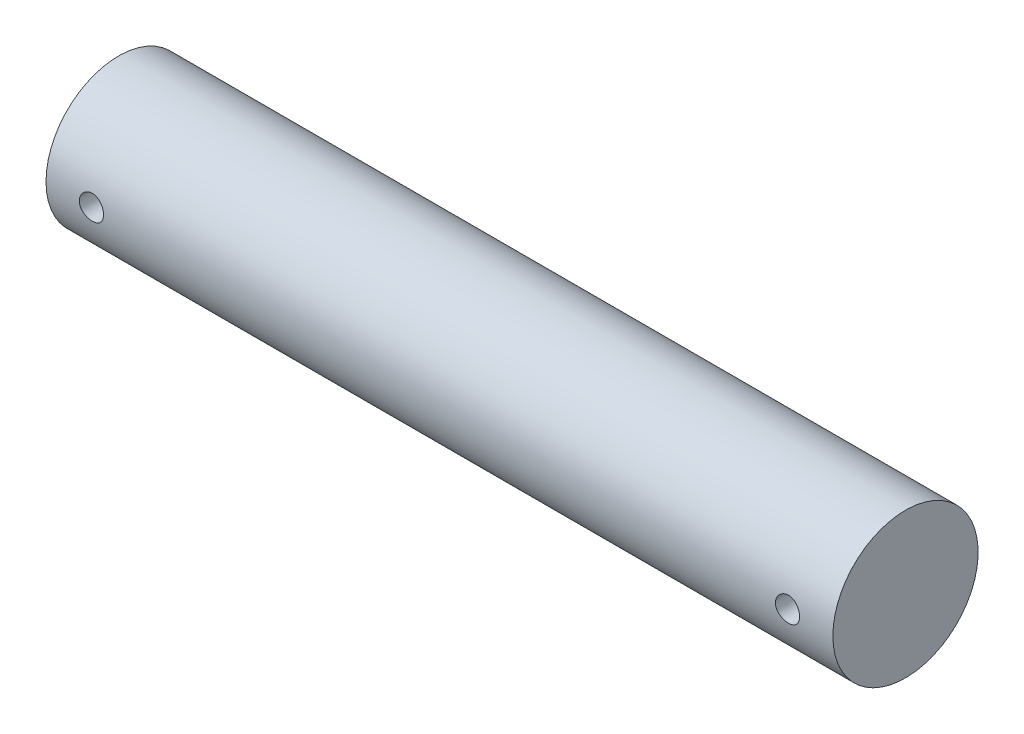
ISO-10303-21;
HEADER;
FILE_DESCRIPTION(('STEP AP214'),'2;1');
FILE_NAME('part.step','',(''),(''),'','','');
FILE_SCHEMA(('AUTOMOTIVE_DESIGN { 1 0 10303 214 1 1 1 1 }'));
ENDSEC;
DATA;
#1=APPLICATION_CONTEXT('core data for automotive mechanical design processes');
#2=APPLICATION_PROTOCOL_DEFINITION('international standard','automotive_design',2000,#1);
#3=PRODUCT_CONTEXT('',#1,'mechanical');
#4=PRODUCT('Part','Part','',(#3));
#5=PRODUCT_RELATED_PRODUCT_CATEGORY('part','',(#4));
#6=PRODUCT_DEFINITION_FORMATION('','',#4);
#7=PRODUCT_DEFINITION_CONTEXT('part definition',#1,'design');
#8=PRODUCT_DEFINITION('design','',#6,#7);
#9=PRODUCT_DEFINITION_SHAPE('','',#8);
#10=(LENGTH_UNIT() NAMED_UNIT(*) SI_UNIT(.MILLI.,.METRE.));
#11=(NAMED_UNIT(*) PLANE_ANGLE_UNIT() SI_UNIT($,.RADIAN.));
#12=(NAMED_UNIT(*) SI_UNIT($,.STERADIAN.) SOLID_ANGLE_UNIT());
#13=UNCERTAINTY_MEASURE_WITH_UNIT(LENGTH_MEASURE(1.E-05),#10,'distance_accuracy_value','');
#14=(GEOMETRIC_REPRESENTATION_CONTEXT(3) GLOBAL_UNCERTAINTY_ASSIGNED_CONTEXT((#13)) GLOBAL_UNIT_ASSIGNED_CONTEXT((#10,
#11,#12)) REPRESENTATION_CONTEXT('',''));
#15=CARTESIAN_POINT('',(0.,0.,0.));
#16=DIRECTION('',(0.,0.,1.));
#17=DIRECTION('',(1.,0.,0.));
#18=AXIS2_PLACEMENT_3D('',#15,#16,#17);
#19=CARTESIAN_POINT('',(0.,0.,0.));
#20=DIRECTION('',(-1.,0.,0.));
#21=DIRECTION('',(0.,0.,1.));
#22=AXIS2_PLACEMENT_3D('',#19,#20,#21);
#23=CYLINDRICAL_SURFACE('',#22,12.);
#24=CARTESIAN_POINT('',(0.,0.,0.));
#25=DIRECTION('',(-1.,0.,0.));
#26=DIRECTION('',(0.,0.,1.));
#27=AXIS2_PLACEMENT_3D('',#24,#25,#26);
#28=CIRCLE('',#27,12.);
#29=CARTESIAN_POINT('',(0.,0.,12.));
#30=VERTEX_POINT('',#29);
#31=EDGE_CURVE('E83',#30,#30,#28,.T.);
#32=ORIENTED_EDGE('',*,*,#31,.F.);
#33=EDGE_LOOP('',(#32));
#34=FACE_BOUND('',#33,.T.);
#35=CARTESIAN_POINT('',(130.,0.,0.));
#36=DIRECTION('',(-1.,0.,0.));
#37=DIRECTION('',(0.,0.,1.));
#38=AXIS2_PLACEMENT_3D('',#35,#36,#37);
#39=CIRCLE('',#38,12.);
#40=CARTESIAN_POINT('',(130.,0.,12.));
#41=VERTEX_POINT('',#40);
#42=EDGE_CURVE('E86',#41,#41,#39,.T.);
#43=ORIENTED_EDGE('',*,*,#42,.T.);
#44=EDGE_LOOP('',(#43));
#45=FACE_BOUND('',#44,.T.);
#46=CARTESIAN_POINT('',(120.5,0.,-12.));
#47=CARTESIAN_POINT('',(120.500004471158,0.11151272396657,-11.9999980893506));
#48=CARTESIAN_POINT('',(120.509357819975,0.223086305471052,-11.9984294233043));
#49=CARTESIAN_POINT('',(120.546508527012,0.443104177338426,-11.9923227595311));
#50=CARTESIAN_POINT('',(120.574322845529,0.551545494367388,-11.9877820313911));
#51=CARTESIAN_POINT('',(120.647532358874,0.762083797770104,-11.9762405458916));
#52=CARTESIAN_POINT('',(120.692913172513,0.864185894745509,-11.9692418012735));
#53=CARTESIAN_POINT('',(120.799929833642,1.05931347358234,-11.9535538166566));
#54=CARTESIAN_POINT('',(120.861563821986,1.15233999190286,-11.9448647700355));
#55=CARTESIAN_POINT('',(120.999964067056,1.32757809143332,-11.9266665396665));
#56=CARTESIAN_POINT('',(121.076855291709,1.40969032282795,-11.9171509745189));
#57=CARTESIAN_POINT('',(121.243318374778,1.55991079892791,-11.8984210150139));
#58=CARTESIAN_POINT('',(121.332891033165,1.62801815951275,-11.8892066397013));
#59=CARTESIAN_POINT('',(121.522856772958,1.74869370048408,-11.8720605260782));
#60=CARTESIAN_POINT('',(121.623313069444,1.80116364228877,-11.8641370327331));
#61=CARTESIAN_POINT('',(121.831767651441,1.88844669232894,-11.8505583183574));
#62=CARTESIAN_POINT('',(121.939765426942,1.92326099325246,-11.8449029441145));
#63=CARTESIAN_POINT('',(122.159184219885,1.97393150222781,-11.836564294742));
#64=CARTESIAN_POINT('',(122.270564589201,1.98995922330829,-11.8338541478856));
#65=CARTESIAN_POINT('',(122.494464221507,2.00313338023187,-11.8316315114932));
#66=CARTESIAN_POINT('',(122.606983403334,2.00028115231117,-11.8321187956577));
#67=CARTESIAN_POINT('',(122.82874228902,1.97591607871689,-11.8362114309084));
#68=CARTESIAN_POINT('',(122.938003842836,1.95459590551179,-11.8397845865513));
#69=CARTESIAN_POINT('',(123.151377054263,1.89420251232273,-11.8495959616881));
#70=CARTESIAN_POINT('',(123.255488535111,1.85512868345576,-11.8558342725862));
#71=CARTESIAN_POINT('',(123.456183058753,1.7601417968751,-11.8703078346728));
#72=CARTESIAN_POINT('',(123.552727524865,1.70414873110374,-11.8785525368586));
#73=CARTESIAN_POINT('',(123.735123520431,1.57696961404592,-11.8961033473201));
#74=CARTESIAN_POINT('',(123.820974185964,1.5057823365234,-11.9054095412343));
#75=CARTESIAN_POINT('',(123.980660868646,1.34918576972722,-11.9241762230383));
#76=CARTESIAN_POINT('',(124.054334814832,1.26361117109848,-11.9336371938532));
#77=CARTESIAN_POINT('',(124.186302210132,1.0812281991853,-11.9515408111738));
#78=CARTESIAN_POINT('',(124.244595560147,0.984419753525123,-11.959983451118));
#79=CARTESIAN_POINT('',(124.344161781709,0.782164732933357,-11.9749111431433));
#80=CARTESIAN_POINT('',(124.385420335465,0.676710980451718,-11.9813945472596));
#81=CARTESIAN_POINT('',(124.449595372197,0.460238676482178,-11.9916600241013));
#82=CARTESIAN_POINT('',(124.472513389579,0.34922059134357,-11.9954423228038));
#83=CARTESIAN_POINT('',(124.499137086769,0.126167921041298,-11.9998490387415));
#84=CARTESIAN_POINT('',(124.503065257444,0.0141605897208096,-12.0005100241023));
#85=CARTESIAN_POINT('',(124.492190924458,-0.208911818311906,-11.9986997953694));
#86=CARTESIAN_POINT('',(124.477389141493,-0.319976931113625,-11.9962287017929));
#87=CARTESIAN_POINT('',(124.429660120532,-0.537324940437402,-11.9884546155056));
#88=CARTESIAN_POINT('',(124.396843033288,-0.643632694708293,-11.9831688384105));
#89=CARTESIAN_POINT('',(124.31413238544,-0.849237507888342,-11.9703557156429));
#90=CARTESIAN_POINT('',(124.264237865892,-0.948534172727763,-11.9628282440962));
#91=CARTESIAN_POINT('',(124.148279100243,-1.13826455157515,-11.9462761304193));
#92=CARTESIAN_POINT('',(124.082075875066,-1.22861220074969,-11.9372388470962));
#93=CARTESIAN_POINT('',(123.935570147692,-1.39699486840212,-11.9187077391352));
#94=CARTESIAN_POINT('',(123.855266621379,-1.47502899175723,-11.9092138813724));
#95=CARTESIAN_POINT('',(123.681841961543,-1.61739422372637,-11.8907214018868));
#96=CARTESIAN_POINT('',(123.588596667588,-1.68157500889094,-11.8817289290969));
#97=CARTESIAN_POINT('',(123.392517624689,-1.79336184823595,-11.8653722382231));
#98=CARTESIAN_POINT('',(123.289684179818,-1.84096842781583,-11.8580079685282));
#99=CARTESIAN_POINT('',(123.07776821375,-1.91803066517849,-11.8457876295816));
#100=CARTESIAN_POINT('',(122.968713523976,-1.94756114603832,-11.8409212344885));
#101=CARTESIAN_POINT('',(122.747103896623,-1.98786836302259,-11.8342217346821));
#102=CARTESIAN_POINT('',(122.634549264214,-1.9986467295569,-11.8323883662618));
#103=CARTESIAN_POINT('',(122.41063586723,-2.00109829283785,-11.8319738646721));
#104=CARTESIAN_POINT('',(122.29927969714,-1.99300810890012,-11.8333524520452));
#105=CARTESIAN_POINT('',(122.079536601559,-1.95846387116545,-11.8391182516298));
#106=CARTESIAN_POINT('',(121.971149666447,-1.93200987688995,-11.8435054540897));
#107=CARTESIAN_POINT('',(121.760513250166,-1.86157959167589,-11.8547788502538));
#108=CARTESIAN_POINT('',(121.658256791955,-1.81762367248032,-11.8616621377574));
#109=CARTESIAN_POINT('',(121.462531464644,-1.71346160313269,-11.8771549513777));
#110=CARTESIAN_POINT('',(121.369063031702,-1.65325464699882,-11.8857645631072));
#111=CARTESIAN_POINT('',(121.192371533514,-1.5174551074977,-11.903867632365));
#112=CARTESIAN_POINT('',(121.10928318664,-1.4416884508749,-11.9133703646104));
#113=CARTESIAN_POINT('',(120.95691871642,-1.27728722510417,-11.9321149788867));
#114=CARTESIAN_POINT('',(120.88764578509,-1.1886496903301,-11.9413568002124));
#115=CARTESIAN_POINT('',(120.76444138544,-1.00029533571221,-11.9586122371378));
#116=CARTESIAN_POINT('',(120.71061916855,-0.900506230026237,-11.9666169300248));
#117=CARTESIAN_POINT('',(120.620584412312,-0.693210455503166,-11.9804093408142));
#118=CARTESIAN_POINT('',(120.584354335136,-0.585711595863991,-11.9861992654199));
#119=CARTESIAN_POINT('',(120.538395780699,-0.398162648036307,-11.9936463266636));
#120=CARTESIAN_POINT('',(120.524020424307,-0.319247064238745,-11.9960162181869));
#121=CARTESIAN_POINT('',(120.504821009724,-0.16023144825584,-11.999193727889));
#122=CARTESIAN_POINT('',(120.49999678709,-0.0801314364867916,-12.0000013729651));
#123=CARTESIAN_POINT('',(120.5,0.,-12.));
#124=B_SPLINE_CURVE_WITH_KNOTS('',3,(#46,#47,#48,#49,#50,#51,#52,#53,#54,#55,#56,#57,#58,#59,
#60,#61,#62,#63,#64,#65,#66,#67,#68,#69,#70,#71,#72,#73,#74,#75,#76,#77,#78,#79,#80,#81,#82,#83,
#84,#85,#86,#87,#88,#89,#90,#91,#92,#93,#94,#95,#96,#97,#98,#99,#100,#101,#102,#103,#104,#105,
#106,#107,#108,#109,#110,#111,#112,#113,#114,#115,#116,#117,#118,#119,#120,#121,#122,#123),
.UNSPECIFIED.,.T.,.F.,(4,2,2,2,2,2,2,2,2,2,2,2,2,2,2,2,2,2,2,2,2,2,2,2,2,2,2,2,2,2,2,2,2,2,2,2,
2,2,4),(0.,0.334245267950801,0.668798036556325,1.00307749362021,1.33731873013981,
1.67441992849863,2.01154240135882,2.35074016659067,2.68991501500939,3.02596861682732,
3.36199843456703,3.6945641740832,4.027141320203,4.3613164530604,4.69551856544451,
5.03386215929053,5.3722079330867,5.71083751132713,6.04943875616909,6.38406306793107,
6.71867450428677,7.05126245605121,7.38386908660841,7.71941460501606,8.05498450443413,
8.3940305760608,8.73306589900739,9.07068817873401,9.4082811022928,9.74166327618146,
10.0750443695049,10.4080385458096,10.7410492402345,11.0780110735469,11.4150506710316,
11.7544178528574,12.0934460170404,12.333633985312,12.5738178182155),.UNSPECIFIED.);
#125=CARTESIAN_POINT('',(120.5,0.,-12.));
#126=VERTEX_POINT('',#125);
#127=EDGE_CURVE('E56',#126,#126,#124,.T.);
#128=ORIENTED_EDGE('',*,*,#127,.F.);
#129=EDGE_LOOP('',(#128));
#130=FACE_BOUND('',#129,.T.);
#131=CARTESIAN_POINT('',(120.5,0.,12.));
#132=CARTESIAN_POINT('',(120.500004471158,-0.11151272396657,11.9999980893506));
#133=CARTESIAN_POINT('',(120.509357819975,-0.223086305471052,11.9984294233043));
#134=CARTESIAN_POINT('',(120.546508527012,-0.443104177338426,11.9923227595311));
#135=CARTESIAN_POINT('',(120.574322845529,-0.551545494367388,11.9877820313911));
#136=CARTESIAN_POINT('',(120.647532358874,-0.762083797770104,11.9762405458916));
#137=CARTESIAN_POINT('',(120.692913172513,-0.864185894745509,11.9692418012735));
#138=CARTESIAN_POINT('',(120.799929833642,-1.05931347358234,11.9535538166566));
#139=CARTESIAN_POINT('',(120.861563821986,-1.15233999190286,11.9448647700355));
#140=CARTESIAN_POINT('',(120.999964067056,-1.32757809143332,11.9266665396665));
#141=CARTESIAN_POINT('',(121.076855291709,-1.40969032282795,11.9171509745189));
#142=CARTESIAN_POINT('',(121.243318374778,-1.55991079892791,11.8984210150139));
#143=CARTESIAN_POINT('',(121.332891033165,-1.62801815951275,11.8892066397013));
#144=CARTESIAN_POINT('',(121.522856772958,-1.74869370048408,11.8720605260782));
#145=CARTESIAN_POINT('',(121.623313069444,-1.80116364228877,11.8641370327331));
#146=CARTESIAN_POINT('',(121.831767651441,-1.88844669232894,11.8505583183574));
#147=CARTESIAN_POINT('',(121.939765426942,-1.92326099325246,11.8449029441145));
#148=CARTESIAN_POINT('',(122.159184219885,-1.97393150222781,11.836564294742));
#149=CARTESIAN_POINT('',(122.270564589201,-1.98995922330829,11.8338541478856));
#150=CARTESIAN_POINT('',(122.494464221507,-2.00313338023187,11.8316315114932));
#151=CARTESIAN_POINT('',(122.606983403334,-2.00028115231117,11.8321187956577));
#152=CARTESIAN_POINT('',(122.82874228902,-1.97591607871689,11.8362114309084));
#153=CARTESIAN_POINT('',(122.938003842836,-1.95459590551179,11.8397845865513));
#154=CARTESIAN_POINT('',(123.151377054263,-1.89420251232273,11.8495959616881));
#155=CARTESIAN_POINT('',(123.255488535111,-1.85512868345576,11.8558342725862));
#156=CARTESIAN_POINT('',(123.456183058753,-1.7601417968751,11.8703078346728));
#157=CARTESIAN_POINT('',(123.552727524865,-1.70414873110374,11.8785525368586));
#158=CARTESIAN_POINT('',(123.735123520431,-1.57696961404592,11.8961033473201));
#159=CARTESIAN_POINT('',(123.820974185964,-1.5057823365234,11.9054095412343));
#160=CARTESIAN_POINT('',(123.980660868646,-1.34918576972722,11.9241762230383));
#161=CARTESIAN_POINT('',(124.054334814832,-1.26361117109848,11.9336371938532));
#162=CARTESIAN_POINT('',(124.186302210132,-1.0812281991853,11.9515408111738));
#163=CARTESIAN_POINT('',(124.244595560147,-0.984419753525123,11.959983451118));
#164=CARTESIAN_POINT('',(124.344161781709,-0.782164732933357,11.9749111431433));
#165=CARTESIAN_POINT('',(124.385420335465,-0.676710980451718,11.9813945472596));
#166=CARTESIAN_POINT('',(124.449595372197,-0.460238676482178,11.9916600241013));
#167=CARTESIAN_POINT('',(124.472513389579,-0.34922059134357,11.9954423228038));
#168=CARTESIAN_POINT('',(124.499137086769,-0.126167921041298,11.9998490387415));
#169=CARTESIAN_POINT('',(124.503065257444,-0.0141605897208096,12.0005100241023));
#170=CARTESIAN_POINT('',(124.492190924458,0.208911818311906,11.9986997953694));
#171=CARTESIAN_POINT('',(124.477389141493,0.319976931113625,11.9962287017929));
#172=CARTESIAN_POINT('',(124.429660120532,0.537324940437402,11.9884546155056));
#173=CARTESIAN_POINT('',(124.396843033288,0.643632694708293,11.9831688384105));
#174=CARTESIAN_POINT('',(124.31413238544,0.849237507888342,11.9703557156429));
#175=CARTESIAN_POINT('',(124.264237865892,0.948534172727763,11.9628282440962));
#176=CARTESIAN_POINT('',(124.148279100243,1.13826455157515,11.9462761304193));
#177=CARTESIAN_POINT('',(124.082075875066,1.22861220074969,11.9372388470962));
#178=CARTESIAN_POINT('',(123.935570147692,1.39699486840212,11.9187077391352));
#179=CARTESIAN_POINT('',(123.855266621379,1.47502899175723,11.9092138813724));
#180=CARTESIAN_POINT('',(123.681841961543,1.61739422372637,11.8907214018868));
#181=CARTESIAN_POINT('',(123.588596667588,1.68157500889094,11.8817289290969));
#182=CARTESIAN_POINT('',(123.392517624689,1.79336184823595,11.8653722382231));
#183=CARTESIAN_POINT('',(123.289684179818,1.84096842781583,11.8580079685282));
#184=CARTESIAN_POINT('',(123.07776821375,1.91803066517849,11.8457876295816));
#185=CARTESIAN_POINT('',(122.968713523976,1.94756114603832,11.8409212344885));
#186=CARTESIAN_POINT('',(122.747103896623,1.98786836302259,11.8342217346821));
#187=CARTESIAN_POINT('',(122.634549264214,1.9986467295569,11.8323883662618));
#188=CARTESIAN_POINT('',(122.41063586723,2.00109829283785,11.8319738646721));
#189=CARTESIAN_POINT('',(122.29927969714,1.99300810890012,11.8333524520452));
#190=CARTESIAN_POINT('',(122.079536601559,1.95846387116545,11.8391182516298));
#191=CARTESIAN_POINT('',(121.971149666447,1.93200987688995,11.8435054540897));
#192=CARTESIAN_POINT('',(121.760513250166,1.86157959167589,11.8547788502538));
#193=CARTESIAN_POINT('',(121.658256791955,1.81762367248032,11.8616621377574));
#194=CARTESIAN_POINT('',(121.462531464644,1.71346160313269,11.8771549513777));
#195=CARTESIAN_POINT('',(121.369063031702,1.65325464699882,11.8857645631072));
#196=CARTESIAN_POINT('',(121.192371533514,1.5174551074977,11.903867632365));
#197=CARTESIAN_POINT('',(121.10928318664,1.4416884508749,11.9133703646104));
#198=CARTESIAN_POINT('',(120.95691871642,1.27728722510417,11.9321149788867));
#199=CARTESIAN_POINT('',(120.88764578509,1.1886496903301,11.9413568002124));
#200=CARTESIAN_POINT('',(120.76444138544,1.00029533571221,11.9586122371378));
#201=CARTESIAN_POINT('',(120.71061916855,0.900506230026237,11.9666169300248));
#202=CARTESIAN_POINT('',(120.620584412312,0.693210455503166,11.9804093408142));
#203=CARTESIAN_POINT('',(120.584354335136,0.585711595863991,11.9861992654199));
#204=CARTESIAN_POINT('',(120.538395780699,0.398162648036307,11.9936463266636));
#205=CARTESIAN_POINT('',(120.524020424307,0.319247064238745,11.9960162181869));
#206=CARTESIAN_POINT('',(120.504821009724,0.16023144825584,11.999193727889));
#207=CARTESIAN_POINT('',(120.49999678709,0.0801314364867916,12.0000013729651));
#208=CARTESIAN_POINT('',(120.5,0.,12.));
#209=B_SPLINE_CURVE_WITH_KNOTS('',3,(#131,#132,#133,#134,#135,#136,#137,#138,#139,#140,#141,
#142,#143,#144,#145,#146,#147,#148,#149,#150,#151,#152,#153,#154,#155,#156,#157,#158,#159,#160,
#161,#162,#163,#164,#165,#166,#167,#168,#169,#170,#171,#172,#173,#174,#175,#176,#177,#178,#179,
#180,#181,#182,#183,#184,#185,#186,#187,#188,#189,#190,#191,#192,#193,#194,#195,#196,#197,#198,
#199,#200,#201,#202,#203,#204,#205,#206,#207,#208),.UNSPECIFIED.,.T.,.F.,(4,2,2,2,2,2,2,2,2,2,2,
2,2,2,2,2,2,2,2,2,2,2,2,2,2,2,2,2,2,2,2,2,2,2,2,2,2,2,4),(0.,0.334245267950801,
0.668798036556325,1.00307749362021,1.33731873013981,1.67441992849863,2.01154240135882,
2.35074016659067,2.68991501500939,3.02596861682732,3.36199843456703,3.6945641740832,
4.027141320203,4.3613164530604,4.69551856544451,5.03386215929053,5.3722079330867,
5.71083751132713,6.04943875616909,6.38406306793107,6.71867450428677,7.05126245605121,
7.38386908660841,7.71941460501606,8.05498450443413,8.3940305760608,8.73306589900739,
9.07068817873401,9.4082811022928,9.74166327618146,10.0750443695049,10.4080385458096,
10.7410492402345,11.0780110735469,11.4150506710316,11.7544178528574,12.0934460170404,
12.333633985312,12.5738178182155),.UNSPECIFIED.);
#210=CARTESIAN_POINT('',(120.5,0.,12.));
#211=VERTEX_POINT('',#210);
#212=EDGE_CURVE('E52',#211,#211,#209,.T.);
#213=ORIENTED_EDGE('',*,*,#212,.F.);
#214=EDGE_LOOP('',(#213));
#215=FACE_BOUND('',#214,.T.);
#216=CARTESIAN_POINT('',(5.5,0.,-12.));
#217=CARTESIAN_POINT('',(5.50000447115825,0.111512723966572,-11.9999980893506));
#218=CARTESIAN_POINT('',(5.50935781997514,0.223086305471057,-11.9984294233043));
#219=CARTESIAN_POINT('',(5.54650852701226,0.443104177338434,-11.9923227595311));
#220=CARTESIAN_POINT('',(5.57432284552928,0.551545494367397,-11.9877820313911));
#221=CARTESIAN_POINT('',(5.6475323588742,0.762083797770115,-11.9762405458916));
#222=CARTESIAN_POINT('',(5.69291317251246,0.86418589474552,-11.9692418012735));
#223=CARTESIAN_POINT('',(5.79992983364192,1.05931347358236,-11.9535538166566));
#224=CARTESIAN_POINT('',(5.8615638219864,1.15233999190287,-11.9448647700355));
#225=CARTESIAN_POINT('',(5.99996406705637,1.32757809143334,-11.9266665396665));
#226=CARTESIAN_POINT('',(6.0768552917089,1.40969032282797,-11.9171509745189));
#227=CARTESIAN_POINT('',(6.24331837477825,1.55991079892794,-11.8984210150139));
#228=CARTESIAN_POINT('',(6.33289103316529,1.62801815951278,-11.8892066397013));
#229=CARTESIAN_POINT('',(6.52285677295764,1.74869370048411,-11.8720605260782));
#230=CARTESIAN_POINT('',(6.6233130694438,1.8011636422888,-11.8641370327331));
#231=CARTESIAN_POINT('',(6.8317676514405,1.88844669232897,-11.8505583183574));
#232=CARTESIAN_POINT('',(6.9397654269421,1.92326099325249,-11.8449029441145));
#233=CARTESIAN_POINT('',(7.15918421988523,1.97393150222785,-11.836564294742));
#234=CARTESIAN_POINT('',(7.27056458920111,1.98995922330832,-11.8338541478856));
#235=CARTESIAN_POINT('',(7.49446422150678,2.0031333802319,-11.8316315114932));
#236=CARTESIAN_POINT('',(7.60698340333384,2.0002811523112,-11.8321187956577));
#237=CARTESIAN_POINT('',(7.82874228902036,1.97591607871692,-11.8362114309084));
#238=CARTESIAN_POINT('',(7.93800384283619,1.95459590551182,-11.8397845865513));
#239=CARTESIAN_POINT('',(8.15137705426331,1.89420251232276,-11.8495959616881));
#240=CARTESIAN_POINT('',(8.25548853511084,1.85512868345579,-11.8558342725862));
#241=CARTESIAN_POINT('',(8.45618305875274,1.76014179687513,-11.8703078346728));
#242=CARTESIAN_POINT('',(8.55272752486498,1.70414873110377,-11.8785525368586));
#243=CARTESIAN_POINT('',(8.73512352043071,1.57696961404595,-11.8961033473201));
#244=CARTESIAN_POINT('',(8.82097418596394,1.50578233652343,-11.9054095412343));
#245=CARTESIAN_POINT('',(8.98066086864588,1.34918576972724,-11.9241762230383));
#246=CARTESIAN_POINT('',(9.05433481483207,1.2636111710985,-11.9336371938532));
#247=CARTESIAN_POINT('',(9.18630221013227,1.08122819918532,-11.9515408111738));
#248=CARTESIAN_POINT('',(9.24459556014658,0.984419753525137,-11.959983451118));
#249=CARTESIAN_POINT('',(9.34416178170903,0.782164732933369,-11.9749111431433));
#250=CARTESIAN_POINT('',(9.385420335465,0.676710980451729,-11.9813945472596));
#251=CARTESIAN_POINT('',(9.44959537219678,0.460238676482185,-11.9916600241013));
#252=CARTESIAN_POINT('',(9.47251338957897,0.349220591343575,-11.9954423228038));
#253=CARTESIAN_POINT('',(9.49913708676891,0.1261679210413,-11.9998490387415));
#254=CARTESIAN_POINT('',(9.50306525744449,0.0141605897208095,-12.0005100241023));
#255=CARTESIAN_POINT('',(9.4921909244575,-0.20891181831191,-11.9986997953694));
#256=CARTESIAN_POINT('',(9.47738914149301,-0.319976931113631,-11.9962287017929));
#257=CARTESIAN_POINT('',(9.42966012053162,-0.537324940437411,-11.9884546155056));
#258=CARTESIAN_POINT('',(9.3968430332879,-0.643632694708303,-11.9831688384105));
#259=CARTESIAN_POINT('',(9.31413238544037,-0.849237507888354,-11.9703557156429));
#260=CARTESIAN_POINT('',(9.26423786589178,-0.948534172727775,-11.9628282440962));
#261=CARTESIAN_POINT('',(9.14827910024257,-1.13826455157517,-11.9462761304193));
#262=CARTESIAN_POINT('',(9.0820758750662,-1.22861220074972,-11.9372388470962));
#263=CARTESIAN_POINT('',(8.93557014769195,-1.39699486840215,-11.9187077391352));
#264=CARTESIAN_POINT('',(8.85526662137866,-1.47502899175727,-11.9092138813724));
#265=CARTESIAN_POINT('',(8.68184196154286,-1.6173942237264,-11.8907214018868));
#266=CARTESIAN_POINT('',(8.58859666758847,-1.68157500889097,-11.8817289290968));
#267=CARTESIAN_POINT('',(8.39251762468917,-1.79336184823599,-11.8653722382231));
#268=CARTESIAN_POINT('',(8.289684179818,-1.84096842781586,-11.8580079685282));
#269=CARTESIAN_POINT('',(8.07776821375029,-1.91803066517852,-11.8457876295816));
#270=CARTESIAN_POINT('',(7.96871352397561,-1.94756114603835,-11.8409212344885));
#271=CARTESIAN_POINT('',(7.74710389662259,-1.98786836302262,-11.8342217346821));
#272=CARTESIAN_POINT('',(7.63454926421436,-1.99864672955693,-11.8323883662618));
#273=CARTESIAN_POINT('',(7.41063586723007,-2.00109829283788,-11.8319738646721));
#274=CARTESIAN_POINT('',(7.29927969713977,-1.99300810890015,-11.8333524520452));
#275=CARTESIAN_POINT('',(7.07953660155939,-1.95846387116548,-11.8391182516298));
#276=CARTESIAN_POINT('',(6.9711496664465,-1.93200987688998,-11.8435054540897));
#277=CARTESIAN_POINT('',(6.76051325016591,-1.86157959167592,-11.8547788502538));
#278=CARTESIAN_POINT('',(6.65825679195518,-1.81762367248035,-11.8616621377574));
#279=CARTESIAN_POINT('',(6.46253146464412,-1.71346160313273,-11.8771549513777));
#280=CARTESIAN_POINT('',(6.36906303170229,-1.65325464699885,-11.8857645631072));
#281=CARTESIAN_POINT('',(6.1923715335138,-1.51745510749772,-11.903867632365));
#282=CARTESIAN_POINT('',(6.10928318663978,-1.44168845087492,-11.9133703646104));
#283=CARTESIAN_POINT('',(5.95691871642005,-1.27728722510418,-11.9321149788867));
#284=CARTESIAN_POINT('',(5.88764578508946,-1.18864969033011,-11.9413568002124));
#285=CARTESIAN_POINT('',(5.76444138544004,-1.00029533571222,-11.9586122371378));
#286=CARTESIAN_POINT('',(5.71061916854964,-0.900506230026254,-11.9666169300248));
#287=CARTESIAN_POINT('',(5.62058441231206,-0.693210455503184,-11.9804093408142));
#288=CARTESIAN_POINT('',(5.58435433513624,-0.585711595864007,-11.9861992654199));
#289=CARTESIAN_POINT('',(5.53839578069867,-0.39816264803632,-11.9936463266636));
#290=CARTESIAN_POINT('',(5.52402042430723,-0.319247064238757,-11.9960162181869));
#291=CARTESIAN_POINT('',(5.5048210097242,-0.160231448255847,-11.999193727889));
#292=CARTESIAN_POINT('',(5.49999678709011,-0.0801314364867952,-12.0000013729651));
#293=CARTESIAN_POINT('',(5.5,0.,-12.));
#294=B_SPLINE_CURVE_WITH_KNOTS('',3,(#216,#217,#218,#219,#220,#221,#222,#223,#224,#225,#226,
#227,#228,#229,#230,#231,#232,#233,#234,#235,#236,#237,#238,#239,#240,#241,#242,#243,#244,#245,
#246,#247,#248,#249,#250,#251,#252,#253,#254,#255,#256,#257,#258,#259,#260,#261,#262,#263,#264,
#265,#266,#267,#268,#269,#270,#271,#272,#273,#274,#275,#276,#277,#278,#279,#280,#281,#282,#283,
#284,#285,#286,#287,#288,#289,#290,#291,#292,#293),.UNSPECIFIED.,.T.,.F.,(4,2,2,2,2,2,2,2,2,2,2,
2,2,2,2,2,2,2,2,2,2,2,2,2,2,2,2,2,2,2,2,2,2,2,2,2,2,2,4),(0.,0.334245267950808,
0.668798036556336,1.00307749362021,1.33731873013983,1.67441992849866,2.01154240135885,
2.35074016659072,2.68991501500945,3.02596861682739,3.36199843456709,3.69456417408327,
4.02714132020305,4.36131645306046,4.69551856544459,5.03386215929061,5.37220793308678,
5.71083751132723,6.04943875616919,6.38406306793117,6.71867450428688,7.05126245605132,
7.38386908660853,7.71941460501619,8.05498450443426,8.39403057606095,8.73306589900754,
9.07068817873417,9.40828110229294,9.7416632761816,10.0750443695051,10.4080385458098,
10.7410492402347,11.0780110735471,11.4150506710318,11.7544178528576,12.0934460170406,
12.3336339853121,12.5738178182157),.UNSPECIFIED.);
#295=CARTESIAN_POINT('',(5.5,0.,-12.));
#296=VERTEX_POINT('',#295);
#297=EDGE_CURVE('E48',#296,#296,#294,.T.);
#298=ORIENTED_EDGE('',*,*,#297,.F.);
#299=EDGE_LOOP('',(#298));
#300=FACE_BOUND('',#299,.T.);
#301=CARTESIAN_POINT('',(5.5,0.,12.));
#302=CARTESIAN_POINT('',(5.50000447115825,-0.111512723966572,11.9999980893506));
#303=CARTESIAN_POINT('',(5.50935781997514,-0.223086305471057,11.9984294233043));
#304=CARTESIAN_POINT('',(5.54650852701226,-0.443104177338434,11.9923227595311));
#305=CARTESIAN_POINT('',(5.57432284552928,-0.551545494367397,11.9877820313911));
#306=CARTESIAN_POINT('',(5.6475323588742,-0.762083797770115,11.9762405458916));
#307=CARTESIAN_POINT('',(5.69291317251246,-0.86418589474552,11.9692418012735));
#308=CARTESIAN_POINT('',(5.79992983364192,-1.05931347358236,11.9535538166566));
#309=CARTESIAN_POINT('',(5.8615638219864,-1.15233999190287,11.9448647700355));
#310=CARTESIAN_POINT('',(5.99996406705637,-1.32757809143334,11.9266665396665));
#311=CARTESIAN_POINT('',(6.0768552917089,-1.40969032282797,11.9171509745189));
#312=CARTESIAN_POINT('',(6.24331837477825,-1.55991079892794,11.8984210150139));
#313=CARTESIAN_POINT('',(6.33289103316529,-1.62801815951278,11.8892066397013));
#314=CARTESIAN_POINT('',(6.52285677295764,-1.74869370048411,11.8720605260782));
#315=CARTESIAN_POINT('',(6.6233130694438,-1.8011636422888,11.8641370327331));
#316=CARTESIAN_POINT('',(6.8317676514405,-1.88844669232897,11.8505583183574));
#317=CARTESIAN_POINT('',(6.9397654269421,-1.92326099325249,11.8449029441145));
#318=CARTESIAN_POINT('',(7.15918421988523,-1.97393150222785,11.836564294742));
#319=CARTESIAN_POINT('',(7.27056458920111,-1.98995922330832,11.8338541478856));
#320=CARTESIAN_POINT('',(7.49446422150678,-2.0031333802319,11.8316315114932));
#321=CARTESIAN_POINT('',(7.60698340333384,-2.0002811523112,11.8321187956577));
#322=CARTESIAN_POINT('',(7.82874228902036,-1.97591607871692,11.8362114309084));
#323=CARTESIAN_POINT('',(7.93800384283619,-1.95459590551182,11.8397845865513));
#324=CARTESIAN_POINT('',(8.15137705426331,-1.89420251232276,11.8495959616881));
#325=CARTESIAN_POINT('',(8.25548853511084,-1.85512868345579,11.8558342725862));
#326=CARTESIAN_POINT('',(8.45618305875274,-1.76014179687513,11.8703078346728));
#327=CARTESIAN_POINT('',(8.55272752486498,-1.70414873110377,11.8785525368586));
#328=CARTESIAN_POINT('',(8.73512352043071,-1.57696961404595,11.8961033473201));
#329=CARTESIAN_POINT('',(8.82097418596394,-1.50578233652343,11.9054095412343));
#330=CARTESIAN_POINT('',(8.98066086864588,-1.34918576972724,11.9241762230383));
#331=CARTESIAN_POINT('',(9.05433481483207,-1.2636111710985,11.9336371938532));
#332=CARTESIAN_POINT('',(9.18630221013227,-1.08122819918532,11.9515408111738));
#333=CARTESIAN_POINT('',(9.24459556014658,-0.984419753525137,11.959983451118));
#334=CARTESIAN_POINT('',(9.34416178170903,-0.782164732933369,11.9749111431433));
#335=CARTESIAN_POINT('',(9.385420335465,-0.676710980451729,11.9813945472596));
#336=CARTESIAN_POINT('',(9.44959537219678,-0.460238676482185,11.9916600241013));
#337=CARTESIAN_POINT('',(9.47251338957897,-0.349220591343575,11.9954423228038));
#338=CARTESIAN_POINT('',(9.49913708676891,-0.1261679210413,11.9998490387415));
#339=CARTESIAN_POINT('',(9.50306525744449,-0.0141605897208095,12.0005100241023));
#340=CARTESIAN_POINT('',(9.4921909244575,0.20891181831191,11.9986997953694));
#341=CARTESIAN_POINT('',(9.47738914149301,0.319976931113631,11.9962287017929));
#342=CARTESIAN_POINT('',(9.42966012053162,0.537324940437411,11.9884546155056));
#343=CARTESIAN_POINT('',(9.3968430332879,0.643632694708303,11.9831688384105));
#344=CARTESIAN_POINT('',(9.31413238544037,0.849237507888354,11.9703557156429));
#345=CARTESIAN_POINT('',(9.26423786589178,0.948534172727775,11.9628282440962));
#346=CARTESIAN_POINT('',(9.14827910024257,1.13826455157517,11.9462761304193));
#347=CARTESIAN_POINT('',(9.0820758750662,1.22861220074972,11.9372388470962));
#348=CARTESIAN_POINT('',(8.93557014769195,1.39699486840215,11.9187077391352));
#349=CARTESIAN_POINT('',(8.85526662137866,1.47502899175727,11.9092138813724));
#350=CARTESIAN_POINT('',(8.68184196154286,1.6173942237264,11.8907214018868));
#351=CARTESIAN_POINT('',(8.58859666758847,1.68157500889097,11.8817289290968));
#352=CARTESIAN_POINT('',(8.39251762468917,1.79336184823599,11.8653722382231));
#353=CARTESIAN_POINT('',(8.289684179818,1.84096842781586,11.8580079685282));
#354=CARTESIAN_POINT('',(8.07776821375029,1.91803066517852,11.8457876295816));
#355=CARTESIAN_POINT('',(7.96871352397561,1.94756114603835,11.8409212344885));
#356=CARTESIAN_POINT('',(7.74710389662259,1.98786836302262,11.8342217346821));
#357=CARTESIAN_POINT('',(7.63454926421436,1.99864672955693,11.8323883662618));
#358=CARTESIAN_POINT('',(7.41063586723007,2.00109829283788,11.8319738646721));
#359=CARTESIAN_POINT('',(7.29927969713977,1.99300810890015,11.8333524520452));
#360=CARTESIAN_POINT('',(7.07953660155939,1.95846387116548,11.8391182516298));
#361=CARTESIAN_POINT('',(6.9711496664465,1.93200987688998,11.8435054540897));
#362=CARTESIAN_POINT('',(6.76051325016591,1.86157959167592,11.8547788502538));
#363=CARTESIAN_POINT('',(6.65825679195518,1.81762367248035,11.8616621377574));
#364=CARTESIAN_POINT('',(6.46253146464412,1.71346160313273,11.8771549513777));
#365=CARTESIAN_POINT('',(6.36906303170229,1.65325464699885,11.8857645631072));
#366=CARTESIAN_POINT('',(6.1923715335138,1.51745510749772,11.903867632365));
#367=CARTESIAN_POINT('',(6.10928318663978,1.44168845087492,11.9133703646104));
#368=CARTESIAN_POINT('',(5.95691871642005,1.27728722510418,11.9321149788867));
#369=CARTESIAN_POINT('',(5.88764578508946,1.18864969033011,11.9413568002124));
#370=CARTESIAN_POINT('',(5.76444138544004,1.00029533571222,11.9586122371378));
#371=CARTESIAN_POINT('',(5.71061916854964,0.900506230026254,11.9666169300248));
#372=CARTESIAN_POINT('',(5.62058441231206,0.693210455503184,11.9804093408142));
#373=CARTESIAN_POINT('',(5.58435433513624,0.585711595864007,11.9861992654199));
#374=CARTESIAN_POINT('',(5.53839578069867,0.39816264803632,11.9936463266636));
#375=CARTESIAN_POINT('',(5.52402042430723,0.319247064238757,11.9960162181869));
#376=CARTESIAN_POINT('',(5.5048210097242,0.160231448255847,11.999193727889));
#377=CARTESIAN_POINT('',(5.49999678709011,0.0801314364867952,12.0000013729651));
#378=CARTESIAN_POINT('',(5.5,0.,12.));
#379=B_SPLINE_CURVE_WITH_KNOTS('',3,(#301,#302,#303,#304,#305,#306,#307,#308,#309,#310,#311,
#312,#313,#314,#315,#316,#317,#318,#319,#320,#321,#322,#323,#324,#325,#326,#327,#328,#329,#330,
#331,#332,#333,#334,#335,#336,#337,#338,#339,#340,#341,#342,#343,#344,#345,#346,#347,#348,#349,
#350,#351,#352,#353,#354,#355,#356,#357,#358,#359,#360,#361,#362,#363,#364,#365,#366,#367,#368,
#369,#370,#371,#372,#373,#374,#375,#376,#377,#378),.UNSPECIFIED.,.T.,.F.,(4,2,2,2,2,2,2,2,2,2,2,
2,2,2,2,2,2,2,2,2,2,2,2,2,2,2,2,2,2,2,2,2,2,2,2,2,2,2,4),(0.,0.334245267950808,
0.668798036556336,1.00307749362021,1.33731873013983,1.67441992849866,2.01154240135885,
2.35074016659072,2.68991501500945,3.02596861682739,3.36199843456709,3.69456417408327,
4.02714132020305,4.36131645306046,4.69551856544459,5.03386215929061,5.37220793308678,
5.71083751132723,6.04943875616919,6.38406306793117,6.71867450428688,7.05126245605132,
7.38386908660853,7.71941460501619,8.05498450443426,8.39403057606095,8.73306589900754,
9.07068817873417,9.40828110229294,9.7416632761816,10.0750443695051,10.4080385458098,
10.7410492402347,11.0780110735471,11.4150506710318,11.7544178528576,12.0934460170406,
12.3336339853121,12.5738178182157),.UNSPECIFIED.);
#380=CARTESIAN_POINT('',(5.5,0.,12.));
#381=VERTEX_POINT('',#380);
#382=EDGE_CURVE('E10',#381,#381,#379,.T.);
#383=ORIENTED_EDGE('',*,*,#382,.F.);
#384=EDGE_LOOP('',(#383));
#385=FACE_BOUND('',#384,.T.);
#386=ADVANCED_FACE('F37',(#34,#45,#130,#215,#300,#385),#23,.T.);
#387=CARTESIAN_POINT('',(0.,0.,0.));
#388=DIRECTION('',(1.,0.,0.));
#389=DIRECTION('',(0.,0.,-1.));
#390=AXIS2_PLACEMENT_3D('',#387,#388,#389);
#391=PLANE('',#390);
#392=ORIENTED_EDGE('',*,*,#31,.T.);
#393=EDGE_LOOP('',(#392));
#394=FACE_BOUND('',#393,.T.);
#395=ADVANCED_FACE('F39',(#394),#391,.F.);
#396=CARTESIAN_POINT('',(130.,0.,-12.));
#397=DIRECTION('',(-1.,0.,0.));
#398=DIRECTION('',(0.,0.,1.));
#399=AXIS2_PLACEMENT_3D('',#396,#397,#398);
#400=PLANE('',#399);
#401=ORIENTED_EDGE('',*,*,#42,.F.);
#402=EDGE_LOOP('',(#401));
#403=FACE_BOUND('',#402,.T.);
#404=ADVANCED_FACE('F75',(#403),#400,.F.);
#405=CARTESIAN_POINT('',(122.5,0.,12.));
#406=DIRECTION('',(0.,0.,-1.));
#407=DIRECTION('',(-1.,0.,0.));
#408=AXIS2_PLACEMENT_3D('',#405,#406,#407);
#409=CYLINDRICAL_SURFACE('',#408,1.99999999999997);
#410=ORIENTED_EDGE('',*,*,#127,.T.);
#411=EDGE_LOOP('',(#410));
#412=FACE_BOUND('',#411,.T.);
#413=ORIENTED_EDGE('',*,*,#212,.T.);
#414=EDGE_LOOP('',(#413));
#415=FACE_BOUND('',#414,.T.);
#416=ADVANCED_FACE('F71',(#412,#415),#409,.F.);
#417=CARTESIAN_POINT('',(7.5,0.,12.));
#418=DIRECTION('',(0.,0.,-1.));
#419=DIRECTION('',(-1.,0.,0.));
#420=AXIS2_PLACEMENT_3D('',#417,#418,#419);
#421=CYLINDRICAL_SURFACE('',#420,2.);
#422=ORIENTED_EDGE('',*,*,#297,.T.);
#423=EDGE_LOOP('',(#422));
#424=FACE_BOUND('',#423,.T.);
#425=ORIENTED_EDGE('',*,*,#382,.T.);
#426=EDGE_LOOP('',(#425));
#427=FACE_BOUND('',#426,.T.);
#428=ADVANCED_FACE('F68',(#424,#427),#421,.F.);
#429=CLOSED_SHELL('',(#386,#395,#404,#416,#428));
#430=MANIFOLD_SOLID_BREP('B2',#429);
#431=ADVANCED_BREP_SHAPE_REPRESENTATION('',(#18,#430),#14);
#432=SHAPE_DEFINITION_REPRESENTATION(#9,#431);
ENDSEC;
END-ISO-10303-21;
